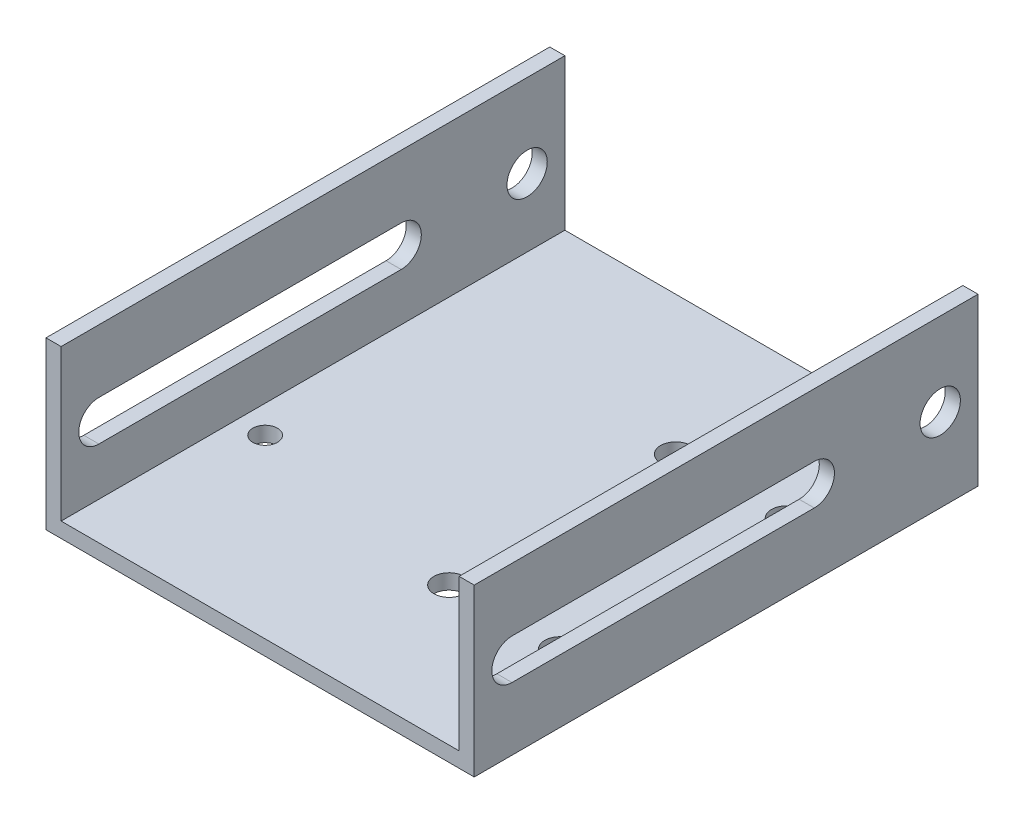
ISO-10303-21;
HEADER;
FILE_DESCRIPTION(('STEP AP214'),'2;1');
FILE_NAME('part.step','',(''),(''),'','','');
FILE_SCHEMA(('AUTOMOTIVE_DESIGN { 1 0 10303 214 1 1 1 1 }'));
ENDSEC;
DATA;
#1=APPLICATION_CONTEXT('core data for automotive mechanical design processes');
#2=APPLICATION_PROTOCOL_DEFINITION('international standard','automotive_design',2000,#1);
#3=PRODUCT_CONTEXT('',#1,'mechanical');
#4=PRODUCT('Part','Part','',(#3));
#5=PRODUCT_RELATED_PRODUCT_CATEGORY('part','',(#4));
#6=PRODUCT_DEFINITION_FORMATION('','',#4);
#7=PRODUCT_DEFINITION_CONTEXT('part definition',#1,'design');
#8=PRODUCT_DEFINITION('design','',#6,#7);
#9=PRODUCT_DEFINITION_SHAPE('','',#8);
#10=(LENGTH_UNIT() NAMED_UNIT(*) SI_UNIT(.MILLI.,.METRE.));
#11=(NAMED_UNIT(*) PLANE_ANGLE_UNIT() SI_UNIT($,.RADIAN.));
#12=(NAMED_UNIT(*) SI_UNIT($,.STERADIAN.) SOLID_ANGLE_UNIT());
#13=UNCERTAINTY_MEASURE_WITH_UNIT(LENGTH_MEASURE(1.E-05),#10,'distance_accuracy_value','');
#14=(GEOMETRIC_REPRESENTATION_CONTEXT(3) GLOBAL_UNCERTAINTY_ASSIGNED_CONTEXT((#13)) GLOBAL_UNIT_ASSIGNED_CONTEXT((#10,
#11,#12)) REPRESENTATION_CONTEXT('',''));
#15=CARTESIAN_POINT('',(0.,0.,0.));
#16=DIRECTION('',(0.,0.,1.));
#17=DIRECTION('',(1.,0.,0.));
#18=AXIS2_PLACEMENT_3D('',#15,#16,#17);
#19=CARTESIAN_POINT('',(0.,3.,0.));
#20=DIRECTION('',(0.,-1.,0.));
#21=DIRECTION('',(0.,0.,-1.));
#22=AXIS2_PLACEMENT_3D('',#19,#20,#21);
#23=PLANE('',#22);
#24=CARTESIAN_POINT('',(-34.,3.,15.));
#25=DIRECTION('',(0.,-1.,0.));
#26=DIRECTION('',(0.,0.,-1.));
#27=AXIS2_PLACEMENT_3D('',#24,#25,#26);
#28=CIRCLE('',#27,2.4454054537415);
#29=CARTESIAN_POINT('',(-34.,3.,12.5545945462585));
#30=VERTEX_POINT('',#29);
#31=EDGE_CURVE('E439',#30,#30,#28,.T.);
#32=ORIENTED_EDGE('',*,*,#31,.T.);
#33=EDGE_LOOP('',(#32));
#34=FACE_BOUND('',#33,.T.);
#35=CARTESIAN_POINT('',(21.,3.,-45.));
#36=DIRECTION('',(0.,-1.,0.));
#37=DIRECTION('',(0.,0.,-1.));
#38=AXIS2_PLACEMENT_3D('',#35,#36,#37);
#39=CIRCLE('',#38,2.00000000000001);
#40=CARTESIAN_POINT('',(21.,3.,-47.));
#41=VERTEX_POINT('',#40);
#42=EDGE_CURVE('E443',#41,#41,#39,.T.);
#43=ORIENTED_EDGE('',*,*,#42,.T.);
#44=EDGE_LOOP('',(#43));
#45=FACE_BOUND('',#44,.T.);
#46=CARTESIAN_POINT('',(32.,3.,22.5));
#47=DIRECTION('',(0.,-1.,0.));
#48=DIRECTION('',(0.,0.,-1.));
#49=AXIS2_PLACEMENT_3D('',#46,#47,#48);
#50=CIRCLE('',#49,3.);
#51=CARTESIAN_POINT('',(32.,3.,19.5));
#52=VERTEX_POINT('',#51);
#53=EDGE_CURVE('E452',#52,#52,#50,.T.);
#54=ORIENTED_EDGE('',*,*,#53,.T.);
#55=EDGE_LOOP('',(#54));
#56=FACE_BOUND('',#55,.T.);
#57=CARTESIAN_POINT('',(9.99999999999999,3.,22.5));
#58=DIRECTION('',(0.,-1.,0.));
#59=DIRECTION('',(0.,0.,-1.));
#60=AXIS2_PLACEMENT_3D('',#57,#58,#59);
#61=CIRCLE('',#60,3.);
#62=CARTESIAN_POINT('',(9.99999999999999,3.,19.5));
#63=VERTEX_POINT('',#62);
#64=EDGE_CURVE('E458',#63,#63,#61,.T.);
#65=ORIENTED_EDGE('',*,*,#64,.T.);
#66=EDGE_LOOP('',(#65));
#67=FACE_BOUND('',#66,.T.);
#68=CARTESIAN_POINT('',(32.,3.,-22.5));
#69=DIRECTION('',(0.,-1.,0.));
#70=DIRECTION('',(0.,0.,-1.));
#71=AXIS2_PLACEMENT_3D('',#68,#69,#70);
#72=CIRCLE('',#71,2.99999999999999);
#73=CARTESIAN_POINT('',(32.,3.,-25.5));
#74=VERTEX_POINT('',#73);
#75=EDGE_CURVE('E464',#74,#74,#72,.T.);
#76=ORIENTED_EDGE('',*,*,#75,.T.);
#77=EDGE_LOOP('',(#76));
#78=FACE_BOUND('',#77,.T.);
#79=CARTESIAN_POINT('',(9.99999999999999,3.,-22.5));
#80=DIRECTION('',(0.,-1.,0.));
#81=DIRECTION('',(0.,0.,-1.));
#82=AXIS2_PLACEMENT_3D('',#79,#80,#81);
#83=CIRCLE('',#82,3.);
#84=CARTESIAN_POINT('',(9.99999999999999,3.,-25.5));
#85=VERTEX_POINT('',#84);
#86=EDGE_CURVE('E470',#85,#85,#83,.T.);
#87=ORIENTED_EDGE('',*,*,#86,.T.);
#88=EDGE_LOOP('',(#87));
#89=FACE_BOUND('',#88,.T.);
#90=CARTESIAN_POINT('',(21.,3.,0.));
#91=DIRECTION('',(0.,-1.,0.));
#92=DIRECTION('',(0.,0.,-1.));
#93=AXIS2_PLACEMENT_3D('',#90,#91,#92);
#94=CIRCLE('',#93,2.99999999999999);
#95=CARTESIAN_POINT('',(21.,3.,-2.99999999999999));
#96=VERTEX_POINT('',#95);
#97=EDGE_CURVE('E476',#96,#96,#94,.T.);
#98=ORIENTED_EDGE('',*,*,#97,.T.);
#99=EDGE_LOOP('',(#98));
#100=FACE_BOUND('',#99,.T.);
#101=DIRECTION('',(0.,0.,1.));
#102=VECTOR('',#101,1.);
#103=CARTESIAN_POINT('',(39.5,3.,50.));
#104=LINE('',#103,#102);
#105=CARTESIAN_POINT('',(39.5,3.,-50.));
#106=VERTEX_POINT('',#105);
#107=CARTESIAN_POINT('',(39.5,3.,50.));
#108=VERTEX_POINT('',#107);
#109=EDGE_CURVE('E209',#106,#108,#104,.T.);
#110=ORIENTED_EDGE('',*,*,#109,.F.);
#111=DIRECTION('',(-1.,0.,0.));
#112=VECTOR('',#111,1.);
#113=CARTESIAN_POINT('',(-42.5,3.,-50.));
#114=LINE('',#113,#112);
#115=CARTESIAN_POINT('',(-39.5,3.,-50.));
#116=VERTEX_POINT('',#115);
#117=EDGE_CURVE('E260',#106,#116,#114,.T.);
#118=ORIENTED_EDGE('',*,*,#117,.T.);
#119=DIRECTION('',(0.,0.,-1.));
#120=VECTOR('',#119,1.);
#121=CARTESIAN_POINT('',(-39.5,3.,-50.));
#122=LINE('',#121,#120);
#123=CARTESIAN_POINT('',(-39.5,3.,50.));
#124=VERTEX_POINT('',#123);
#125=EDGE_CURVE('E228',#124,#116,#122,.T.);
#126=ORIENTED_EDGE('',*,*,#125,.F.);
#127=DIRECTION('',(1.,0.,0.));
#128=VECTOR('',#127,1.);
#129=CARTESIAN_POINT('',(-42.5,3.,50.));
#130=LINE('',#129,#128);
#131=EDGE_CURVE('E248',#124,#108,#130,.T.);
#132=ORIENTED_EDGE('',*,*,#131,.T.);
#133=EDGE_LOOP('',(#110,#118,#126,#132));
#134=FACE_BOUND('',#133,.T.);
#135=ADVANCED_FACE('F34',(#34,#45,#56,#67,#78,#89,#100,#134),#23,.F.);
#136=CARTESIAN_POINT('',(42.5,3.,50.));
#137=DIRECTION('',(-1.,0.,0.));
#138=DIRECTION('',(0.,0.,1.));
#139=AXIS2_PLACEMENT_3D('',#136,#137,#138);
#140=PLANE('',#139);
#141=DIRECTION('',(0.,0.,1.));
#142=VECTOR('',#141,1.);
#143=CARTESIAN_POINT('',(42.5,20.5,42.5));
#144=LINE('',#143,#142);
#145=CARTESIAN_POINT('',(42.5,20.5,-17.5));
#146=VERTEX_POINT('',#145);
#147=CARTESIAN_POINT('',(42.5,20.5,42.5));
#148=VERTEX_POINT('',#147);
#149=EDGE_CURVE('E162',#146,#148,#144,.T.);
#150=ORIENTED_EDGE('',*,*,#149,.F.);
#151=CARTESIAN_POINT('',(42.5,16.5,-17.5));
#152=DIRECTION('',(1.,0.,0.));
#153=DIRECTION('',(0.,0.,-1.));
#154=AXIS2_PLACEMENT_3D('',#151,#152,#153);
#155=CIRCLE('',#154,4.);
#156=CARTESIAN_POINT('',(42.5,12.5,-17.5));
#157=VERTEX_POINT('',#156);
#158=EDGE_CURVE('E49',#157,#146,#155,.T.);
#159=ORIENTED_EDGE('',*,*,#158,.F.);
#160=DIRECTION('',(0.,0.,-1.));
#161=VECTOR('',#160,1.);
#162=CARTESIAN_POINT('',(42.5,12.5,42.5));
#163=LINE('',#162,#161);
#164=CARTESIAN_POINT('',(42.5,12.5,42.5));
#165=VERTEX_POINT('',#164);
#166=EDGE_CURVE('E169',#165,#157,#163,.T.);
#167=ORIENTED_EDGE('',*,*,#166,.F.);
#168=CARTESIAN_POINT('',(42.5,16.5,42.5));
#169=DIRECTION('',(1.,0.,0.));
#170=DIRECTION('',(0.,0.,-1.));
#171=AXIS2_PLACEMENT_3D('',#168,#169,#170);
#172=CIRCLE('',#171,4.00000000000001);
#173=EDGE_CURVE('E153',#148,#165,#172,.T.);
#174=ORIENTED_EDGE('',*,*,#173,.F.);
#175=EDGE_LOOP('',(#150,#159,#167,#174));
#176=FACE_BOUND('',#175,.T.);
#177=CARTESIAN_POINT('',(42.5,16.5,-42.5));
#178=DIRECTION('',(1.,0.,0.));
#179=DIRECTION('',(0.,0.,-1.));
#180=AXIS2_PLACEMENT_3D('',#177,#178,#179);
#181=CIRCLE('',#180,4.00000000000001);
#182=CARTESIAN_POINT('',(42.5,16.5,-46.5));
#183=VERTEX_POINT('',#182);
#184=EDGE_CURVE('E199',#183,#183,#181,.T.);
#185=ORIENTED_EDGE('',*,*,#184,.F.);
#186=EDGE_LOOP('',(#185));
#187=FACE_BOUND('',#186,.T.);
#188=DIRECTION('',(0.,0.,-1.));
#189=VECTOR('',#188,1.);
#190=CARTESIAN_POINT('',(42.5,0.,50.));
#191=LINE('',#190,#189);
#192=CARTESIAN_POINT('',(42.5,0.,50.));
#193=VERTEX_POINT('',#192);
#194=CARTESIAN_POINT('',(42.5,0.,-50.));
#195=VERTEX_POINT('',#194);
#196=EDGE_CURVE('E257',#193,#195,#191,.T.);
#197=ORIENTED_EDGE('',*,*,#196,.T.);
#198=DIRECTION('',(0.,-1.,0.));
#199=VECTOR('',#198,1.);
#200=CARTESIAN_POINT('',(42.5,3.,-50.));
#201=LINE('',#200,#199);
#202=CARTESIAN_POINT('',(42.5,33.,-50.));
#203=VERTEX_POINT('',#202);
#204=EDGE_CURVE('E267',#203,#195,#201,.T.);
#205=ORIENTED_EDGE('',*,*,#204,.F.);
#206=DIRECTION('',(0.,0.,-1.));
#207=VECTOR('',#206,1.);
#208=CARTESIAN_POINT('',(42.5,33.,50.));
#209=LINE('',#208,#207);
#210=CARTESIAN_POINT('',(42.5,33.,50.));
#211=VERTEX_POINT('',#210);
#212=EDGE_CURVE('E210',#211,#203,#209,.T.);
#213=ORIENTED_EDGE('',*,*,#212,.F.);
#214=DIRECTION('',(0.,-1.,0.));
#215=VECTOR('',#214,1.);
#216=CARTESIAN_POINT('',(42.5,3.,50.));
#217=LINE('',#216,#215);
#218=EDGE_CURVE('E338',#211,#193,#217,.T.);
#219=ORIENTED_EDGE('',*,*,#218,.T.);
#220=EDGE_LOOP('',(#197,#205,#213,#219));
#221=FACE_BOUND('',#220,.T.);
#222=ADVANCED_FACE('F36',(#176,#187,#221),#140,.F.);
#223=CARTESIAN_POINT('',(-42.5,3.,-50.));
#224=DIRECTION('',(0.,0.,1.));
#225=DIRECTION('',(1.,0.,0.));
#226=AXIS2_PLACEMENT_3D('',#223,#224,#225);
#227=PLANE('',#226);
#228=DIRECTION('',(-1.,0.,0.));
#229=VECTOR('',#228,1.);
#230=CARTESIAN_POINT('',(-42.5,0.,-50.));
#231=LINE('',#230,#229);
#232=CARTESIAN_POINT('',(-42.5,0.,-50.));
#233=VERTEX_POINT('',#232);
#234=EDGE_CURVE('E317',#195,#233,#231,.T.);
#235=ORIENTED_EDGE('',*,*,#234,.T.);
#236=DIRECTION('',(0.,-1.,0.));
#237=VECTOR('',#236,1.);
#238=CARTESIAN_POINT('',(-42.5,3.,-50.));
#239=LINE('',#238,#237);
#240=CARTESIAN_POINT('',(-42.5,33.,-50.));
#241=VERTEX_POINT('',#240);
#242=EDGE_CURVE('E320',#241,#233,#239,.T.);
#243=ORIENTED_EDGE('',*,*,#242,.F.);
#244=DIRECTION('',(-1.,0.,0.));
#245=VECTOR('',#244,1.);
#246=CARTESIAN_POINT('',(-42.5,33.,-50.));
#247=LINE('',#246,#245);
#248=CARTESIAN_POINT('',(-39.5,33.,-50.));
#249=VERTEX_POINT('',#248);
#250=EDGE_CURVE('E236',#249,#241,#247,.T.);
#251=ORIENTED_EDGE('',*,*,#250,.F.);
#252=DIRECTION('',(0.,-1.,0.));
#253=VECTOR('',#252,1.);
#254=CARTESIAN_POINT('',(-39.5,33.,-50.));
#255=LINE('',#254,#253);
#256=EDGE_CURVE('E239',#249,#116,#255,.T.);
#257=ORIENTED_EDGE('',*,*,#256,.T.);
#258=ORIENTED_EDGE('',*,*,#117,.F.);
#259=DIRECTION('',(0.,-1.,0.));
#260=VECTOR('',#259,1.);
#261=CARTESIAN_POINT('',(39.5,33.,-50.));
#262=LINE('',#261,#260);
#263=CARTESIAN_POINT('',(39.5,33.,-50.));
#264=VERTEX_POINT('',#263);
#265=EDGE_CURVE('E225',#264,#106,#262,.T.);
#266=ORIENTED_EDGE('',*,*,#265,.F.);
#267=DIRECTION('',(-1.,0.,0.));
#268=VECTOR('',#267,1.);
#269=CARTESIAN_POINT('',(42.5,33.,-50.));
#270=LINE('',#269,#268);
#271=EDGE_CURVE('E213',#203,#264,#270,.T.);
#272=ORIENTED_EDGE('',*,*,#271,.F.);
#273=ORIENTED_EDGE('',*,*,#204,.T.);
#274=EDGE_LOOP('',(#235,#243,#251,#257,#258,#266,#272,#273));
#275=FACE_BOUND('',#274,.T.);
#276=ADVANCED_FACE('F294',(#275),#227,.F.);
#277=CARTESIAN_POINT('',(-42.5,3.,50.));
#278=DIRECTION('',(1.,0.,0.));
#279=DIRECTION('',(0.,0.,-1.));
#280=AXIS2_PLACEMENT_3D('',#277,#278,#279);
#281=PLANE('',#280);
#282=DIRECTION('',(0.,0.,1.));
#283=VECTOR('',#282,1.);
#284=CARTESIAN_POINT('',(-42.5,12.5,42.5));
#285=LINE('',#284,#283);
#286=CARTESIAN_POINT('',(-42.5,12.5,-17.5));
#287=VERTEX_POINT('',#286);
#288=CARTESIAN_POINT('',(-42.5,12.5,42.5));
#289=VERTEX_POINT('',#288);
#290=EDGE_CURVE('E480',#287,#289,#285,.T.);
#291=ORIENTED_EDGE('',*,*,#290,.F.);
#292=CARTESIAN_POINT('',(-42.5,16.5,-17.5));
#293=DIRECTION('',(1.,0.,0.));
#294=DIRECTION('',(0.,0.,-1.));
#295=AXIS2_PLACEMENT_3D('',#292,#293,#294);
#296=CIRCLE('',#295,4.);
#297=CARTESIAN_POINT('',(-42.5,20.5,-17.5));
#298=VERTEX_POINT('',#297);
#299=EDGE_CURVE('E187',#298,#287,#296,.F.);
#300=ORIENTED_EDGE('',*,*,#299,.F.);
#301=DIRECTION('',(0.,0.,-1.));
#302=VECTOR('',#301,1.);
#303=CARTESIAN_POINT('',(-42.5,20.5,42.5));
#304=LINE('',#303,#302);
#305=CARTESIAN_POINT('',(-42.5,20.5,42.5));
#306=VERTEX_POINT('',#305);
#307=EDGE_CURVE('E184',#306,#298,#304,.T.);
#308=ORIENTED_EDGE('',*,*,#307,.F.);
#309=CARTESIAN_POINT('',(-42.5,16.5,42.5));
#310=DIRECTION('',(1.,0.,0.));
#311=DIRECTION('',(0.,0.,-1.));
#312=AXIS2_PLACEMENT_3D('',#309,#310,#311);
#313=CIRCLE('',#312,4.00000000000001);
#314=EDGE_CURVE('E177',#289,#306,#313,.F.);
#315=ORIENTED_EDGE('',*,*,#314,.F.);
#316=EDGE_LOOP('',(#291,#300,#308,#315));
#317=FACE_BOUND('',#316,.T.);
#318=CARTESIAN_POINT('',(-42.5,16.5,-42.5));
#319=DIRECTION('',(1.,0.,0.));
#320=DIRECTION('',(0.,0.,-1.));
#321=AXIS2_PLACEMENT_3D('',#318,#319,#320);
#322=CIRCLE('',#321,4.00000000000001);
#323=CARTESIAN_POINT('',(-42.5,16.5,-46.5));
#324=VERTEX_POINT('',#323);
#325=EDGE_CURVE('E202',#324,#324,#322,.F.);
#326=ORIENTED_EDGE('',*,*,#325,.F.);
#327=EDGE_LOOP('',(#326));
#328=FACE_BOUND('',#327,.T.);
#329=DIRECTION('',(0.,0.,1.));
#330=VECTOR('',#329,1.);
#331=CARTESIAN_POINT('',(-42.5,0.,50.));
#332=LINE('',#331,#330);
#333=CARTESIAN_POINT('',(-42.5,0.,50.));
#334=VERTEX_POINT('',#333);
#335=EDGE_CURVE('E326',#233,#334,#332,.T.);
#336=ORIENTED_EDGE('',*,*,#335,.T.);
#337=DIRECTION('',(0.,-1.,0.));
#338=VECTOR('',#337,1.);
#339=CARTESIAN_POINT('',(-42.5,3.,50.));
#340=LINE('',#339,#338);
#341=CARTESIAN_POINT('',(-42.5,33.,50.));
#342=VERTEX_POINT('',#341);
#343=EDGE_CURVE('E331',#342,#334,#340,.T.);
#344=ORIENTED_EDGE('',*,*,#343,.F.);
#345=DIRECTION('',(0.,0.,1.));
#346=VECTOR('',#345,1.);
#347=CARTESIAN_POINT('',(-42.5,33.,-50.));
#348=LINE('',#347,#346);
#349=EDGE_CURVE('E229',#241,#342,#348,.T.);
#350=ORIENTED_EDGE('',*,*,#349,.F.);
#351=ORIENTED_EDGE('',*,*,#242,.T.);
#352=EDGE_LOOP('',(#336,#344,#350,#351));
#353=FACE_BOUND('',#352,.T.);
#354=ADVANCED_FACE('F308',(#317,#328,#353),#281,.F.);
#355=CARTESIAN_POINT('',(-42.5,3.,50.));
#356=DIRECTION('',(0.,0.,-1.));
#357=DIRECTION('',(-1.,0.,0.));
#358=AXIS2_PLACEMENT_3D('',#355,#356,#357);
#359=PLANE('',#358);
#360=DIRECTION('',(1.,0.,0.));
#361=VECTOR('',#360,1.);
#362=CARTESIAN_POINT('',(-42.5,0.,50.));
#363=LINE('',#362,#361);
#364=EDGE_CURVE('E262',#334,#193,#363,.T.);
#365=ORIENTED_EDGE('',*,*,#364,.T.);
#366=ORIENTED_EDGE('',*,*,#218,.F.);
#367=DIRECTION('',(1.,0.,0.));
#368=VECTOR('',#367,1.);
#369=CARTESIAN_POINT('',(42.5,33.,50.));
#370=LINE('',#369,#368);
#371=CARTESIAN_POINT('',(39.5,33.,50.));
#372=VERTEX_POINT('',#371);
#373=EDGE_CURVE('E217',#372,#211,#370,.T.);
#374=ORIENTED_EDGE('',*,*,#373,.F.);
#375=DIRECTION('',(0.,-1.,0.));
#376=VECTOR('',#375,1.);
#377=CARTESIAN_POINT('',(39.5,33.,50.));
#378=LINE('',#377,#376);
#379=EDGE_CURVE('E220',#372,#108,#378,.T.);
#380=ORIENTED_EDGE('',*,*,#379,.T.);
#381=ORIENTED_EDGE('',*,*,#131,.F.);
#382=DIRECTION('',(0.,-1.,0.));
#383=VECTOR('',#382,1.);
#384=CARTESIAN_POINT('',(-39.5,33.,50.));
#385=LINE('',#384,#383);
#386=CARTESIAN_POINT('',(-39.5,33.,50.));
#387=VERTEX_POINT('',#386);
#388=EDGE_CURVE('E252',#387,#124,#385,.T.);
#389=ORIENTED_EDGE('',*,*,#388,.F.);
#390=DIRECTION('',(1.,0.,0.));
#391=VECTOR('',#390,1.);
#392=CARTESIAN_POINT('',(-42.5,33.,50.));
#393=LINE('',#392,#391);
#394=EDGE_CURVE('E232',#342,#387,#393,.T.);
#395=ORIENTED_EDGE('',*,*,#394,.F.);
#396=ORIENTED_EDGE('',*,*,#343,.T.);
#397=EDGE_LOOP('',(#365,#366,#374,#380,#381,#389,#395,#396));
#398=FACE_BOUND('',#397,.T.);
#399=ADVANCED_FACE('F304',(#398),#359,.F.);
#400=CARTESIAN_POINT('',(0.,0.,0.));
#401=DIRECTION('',(0.,-1.,0.));
#402=DIRECTION('',(0.,0.,-1.));
#403=AXIS2_PLACEMENT_3D('',#400,#401,#402);
#404=PLANE('',#403);
#405=CARTESIAN_POINT('',(-34.,0.,15.));
#406=DIRECTION('',(0.,-1.,0.));
#407=DIRECTION('',(0.,0.,-1.));
#408=AXIS2_PLACEMENT_3D('',#405,#406,#407);
#409=CIRCLE('',#408,2.4454054537415);
#410=CARTESIAN_POINT('',(-34.,0.,12.5545945462585));
#411=VERTEX_POINT('',#410);
#412=EDGE_CURVE('E437',#411,#411,#409,.T.);
#413=ORIENTED_EDGE('',*,*,#412,.F.);
#414=EDGE_LOOP('',(#413));
#415=FACE_BOUND('',#414,.T.);
#416=CARTESIAN_POINT('',(21.,0.,-45.));
#417=DIRECTION('',(0.,-1.,0.));
#418=DIRECTION('',(0.,0.,-1.));
#419=AXIS2_PLACEMENT_3D('',#416,#417,#418);
#420=CIRCLE('',#419,2.00000000000001);
#421=CARTESIAN_POINT('',(21.,0.,-47.));
#422=VERTEX_POINT('',#421);
#423=EDGE_CURVE('E440',#422,#422,#420,.T.);
#424=ORIENTED_EDGE('',*,*,#423,.F.);
#425=EDGE_LOOP('',(#424));
#426=FACE_BOUND('',#425,.T.);
#427=CARTESIAN_POINT('',(32.,0.,22.5));
#428=DIRECTION('',(0.,-1.,0.));
#429=DIRECTION('',(0.,0.,-1.));
#430=AXIS2_PLACEMENT_3D('',#427,#428,#429);
#431=CIRCLE('',#430,3.);
#432=CARTESIAN_POINT('',(32.,0.,19.5));
#433=VERTEX_POINT('',#432);
#434=EDGE_CURVE('E449',#433,#433,#431,.T.);
#435=ORIENTED_EDGE('',*,*,#434,.F.);
#436=EDGE_LOOP('',(#435));
#437=FACE_BOUND('',#436,.T.);
#438=CARTESIAN_POINT('',(9.99999999999999,0.,22.5));
#439=DIRECTION('',(0.,-1.,0.));
#440=DIRECTION('',(0.,0.,1.));
#441=AXIS2_PLACEMENT_3D('',#438,#439,#440);
#442=CIRCLE('',#441,3.);
#443=CARTESIAN_POINT('',(9.99999999999999,0.,25.5));
#444=VERTEX_POINT('',#443);
#445=EDGE_CURVE('E455',#444,#444,#442,.T.);
#446=ORIENTED_EDGE('',*,*,#445,.F.);
#447=EDGE_LOOP('',(#446));
#448=FACE_BOUND('',#447,.T.);
#449=CARTESIAN_POINT('',(32.,0.,-22.5));
#450=DIRECTION('',(0.,-1.,0.));
#451=DIRECTION('',(0.,0.,1.));
#452=AXIS2_PLACEMENT_3D('',#449,#450,#451);
#453=CIRCLE('',#452,2.99999999999999);
#454=CARTESIAN_POINT('',(32.,0.,-19.5));
#455=VERTEX_POINT('',#454);
#456=EDGE_CURVE('E461',#455,#455,#453,.T.);
#457=ORIENTED_EDGE('',*,*,#456,.F.);
#458=EDGE_LOOP('',(#457));
#459=FACE_BOUND('',#458,.T.);
#460=CARTESIAN_POINT('',(9.99999999999999,0.,-22.5));
#461=DIRECTION('',(0.,-1.,0.));
#462=DIRECTION('',(0.,0.,-1.));
#463=AXIS2_PLACEMENT_3D('',#460,#461,#462);
#464=CIRCLE('',#463,3.);
#465=CARTESIAN_POINT('',(9.99999999999999,0.,-25.5));
#466=VERTEX_POINT('',#465);
#467=EDGE_CURVE('E467',#466,#466,#464,.T.);
#468=ORIENTED_EDGE('',*,*,#467,.F.);
#469=EDGE_LOOP('',(#468));
#470=FACE_BOUND('',#469,.T.);
#471=CARTESIAN_POINT('',(21.,0.,0.));
#472=DIRECTION('',(0.,-1.,0.));
#473=DIRECTION('',(0.,0.,-1.));
#474=AXIS2_PLACEMENT_3D('',#471,#472,#473);
#475=CIRCLE('',#474,2.99999999999999);
#476=CARTESIAN_POINT('',(21.,0.,-2.99999999999999));
#477=VERTEX_POINT('',#476);
#478=EDGE_CURVE('E473',#477,#477,#475,.T.);
#479=ORIENTED_EDGE('',*,*,#478,.F.);
#480=EDGE_LOOP('',(#479));
#481=FACE_BOUND('',#480,.T.);
#482=ORIENTED_EDGE('',*,*,#196,.F.);
#483=ORIENTED_EDGE('',*,*,#364,.F.);
#484=ORIENTED_EDGE('',*,*,#335,.F.);
#485=ORIENTED_EDGE('',*,*,#234,.F.);
#486=EDGE_LOOP('',(#482,#483,#484,#485));
#487=FACE_BOUND('',#486,.T.);
#488=ADVANCED_FACE('F301',(#415,#426,#437,#448,#459,#470,#481,#487),#404,.T.);
#489=CARTESIAN_POINT('',(-39.5,33.,-50.));
#490=DIRECTION('',(-1.,0.,0.));
#491=DIRECTION('',(0.,0.,1.));
#492=AXIS2_PLACEMENT_3D('',#489,#490,#491);
#493=PLANE('',#492);
#494=DIRECTION('',(0.,0.,-1.));
#495=VECTOR('',#494,1.);
#496=CARTESIAN_POINT('',(-39.5,20.5,-50.));
#497=LINE('',#496,#495);
#498=CARTESIAN_POINT('',(-39.5,20.5,42.5));
#499=VERTEX_POINT('',#498);
#500=CARTESIAN_POINT('',(-39.5,20.5,-17.5));
#501=VERTEX_POINT('',#500);
#502=EDGE_CURVE('E186',#499,#501,#497,.T.);
#503=ORIENTED_EDGE('',*,*,#502,.T.);
#504=CARTESIAN_POINT('',(-39.5,16.5,-17.5));
#505=DIRECTION('',(-1.,0.,0.));
#506=DIRECTION('',(0.,0.,1.));
#507=AXIS2_PLACEMENT_3D('',#504,#505,#506);
#508=CIRCLE('',#507,4.);
#509=CARTESIAN_POINT('',(-39.5,12.5,-17.5));
#510=VERTEX_POINT('',#509);
#511=EDGE_CURVE('E196',#501,#510,#508,.T.);
#512=ORIENTED_EDGE('',*,*,#511,.T.);
#513=DIRECTION('',(0.,0.,1.));
#514=VECTOR('',#513,1.);
#515=CARTESIAN_POINT('',(-39.5,12.5,-50.));
#516=LINE('',#515,#514);
#517=CARTESIAN_POINT('',(-39.5,12.5,42.5));
#518=VERTEX_POINT('',#517);
#519=EDGE_CURVE('E193',#510,#518,#516,.T.);
#520=ORIENTED_EDGE('',*,*,#519,.T.);
#521=CARTESIAN_POINT('',(-39.5,16.5,42.5));
#522=DIRECTION('',(-1.,0.,0.));
#523=DIRECTION('',(0.,0.,1.));
#524=AXIS2_PLACEMENT_3D('',#521,#522,#523);
#525=CIRCLE('',#524,4.00000000000001);
#526=EDGE_CURVE('E190',#518,#499,#525,.T.);
#527=ORIENTED_EDGE('',*,*,#526,.T.);
#528=EDGE_LOOP('',(#503,#512,#520,#527));
#529=FACE_BOUND('',#528,.T.);
#530=CARTESIAN_POINT('',(-39.5,16.5,-42.5));
#531=DIRECTION('',(-1.,0.,0.));
#532=DIRECTION('',(0.,0.,1.));
#533=AXIS2_PLACEMENT_3D('',#530,#531,#532);
#534=CIRCLE('',#533,4.00000000000001);
#535=CARTESIAN_POINT('',(-39.5,16.5,-38.5));
#536=VERTEX_POINT('',#535);
#537=EDGE_CURVE('E206',#536,#536,#534,.T.);
#538=ORIENTED_EDGE('',*,*,#537,.T.);
#539=EDGE_LOOP('',(#538));
#540=FACE_BOUND('',#539,.T.);
#541=ORIENTED_EDGE('',*,*,#125,.T.);
#542=ORIENTED_EDGE('',*,*,#256,.F.);
#543=DIRECTION('',(0.,0.,-1.));
#544=VECTOR('',#543,1.);
#545=CARTESIAN_POINT('',(-39.5,33.,-50.));
#546=LINE('',#545,#544);
#547=EDGE_CURVE('E234',#387,#249,#546,.T.);
#548=ORIENTED_EDGE('',*,*,#547,.F.);
#549=ORIENTED_EDGE('',*,*,#388,.T.);
#550=EDGE_LOOP('',(#541,#542,#548,#549));
#551=FACE_BOUND('',#550,.T.);
#552=ADVANCED_FACE('F299',(#529,#540,#551),#493,.F.);
#553=CARTESIAN_POINT('',(0.,33.,0.));
#554=DIRECTION('',(0.,1.,0.));
#555=DIRECTION('',(0.,0.,1.));
#556=AXIS2_PLACEMENT_3D('',#553,#554,#555);
#557=PLANE('',#556);
#558=ORIENTED_EDGE('',*,*,#349,.T.);
#559=ORIENTED_EDGE('',*,*,#394,.T.);
#560=ORIENTED_EDGE('',*,*,#547,.T.);
#561=ORIENTED_EDGE('',*,*,#250,.T.);
#562=EDGE_LOOP('',(#558,#559,#560,#561));
#563=FACE_BOUND('',#562,.T.);
#564=ADVANCED_FACE('F346',(#563),#557,.T.);
#565=CARTESIAN_POINT('',(39.5,33.,50.));
#566=DIRECTION('',(1.,0.,0.));
#567=DIRECTION('',(0.,0.,-1.));
#568=AXIS2_PLACEMENT_3D('',#565,#566,#567);
#569=PLANE('',#568);
#570=DIRECTION('',(0.,0.,-1.));
#571=VECTOR('',#570,1.);
#572=CARTESIAN_POINT('',(39.5,12.5,50.));
#573=LINE('',#572,#571);
#574=CARTESIAN_POINT('',(39.5,12.5,42.5));
#575=VERTEX_POINT('',#574);
#576=CARTESIAN_POINT('',(39.5,12.5,-17.5));
#577=VERTEX_POINT('',#576);
#578=EDGE_CURVE('E42',#575,#577,#573,.T.);
#579=ORIENTED_EDGE('',*,*,#578,.T.);
#580=CARTESIAN_POINT('',(39.5,16.5,-17.5));
#581=DIRECTION('',(1.,0.,0.));
#582=DIRECTION('',(0.,0.,-1.));
#583=AXIS2_PLACEMENT_3D('',#580,#581,#582);
#584=CIRCLE('',#583,4.);
#585=CARTESIAN_POINT('',(39.5,20.5,-17.5));
#586=VERTEX_POINT('',#585);
#587=EDGE_CURVE('E11',#577,#586,#584,.T.);
#588=ORIENTED_EDGE('',*,*,#587,.T.);
#589=DIRECTION('',(0.,0.,1.));
#590=VECTOR('',#589,1.);
#591=CARTESIAN_POINT('',(39.5,20.5,50.));
#592=LINE('',#591,#590);
#593=CARTESIAN_POINT('',(39.5,20.5,42.5));
#594=VERTEX_POINT('',#593);
#595=EDGE_CURVE('E265',#586,#594,#592,.T.);
#596=ORIENTED_EDGE('',*,*,#595,.T.);
#597=CARTESIAN_POINT('',(39.5,16.5,42.5));
#598=DIRECTION('',(1.,0.,0.));
#599=DIRECTION('',(0.,0.,-1.));
#600=AXIS2_PLACEMENT_3D('',#597,#598,#599);
#601=CIRCLE('',#600,4.00000000000001);
#602=EDGE_CURVE('E156',#594,#575,#601,.T.);
#603=ORIENTED_EDGE('',*,*,#602,.T.);
#604=EDGE_LOOP('',(#579,#588,#596,#603));
#605=FACE_BOUND('',#604,.T.);
#606=CARTESIAN_POINT('',(39.5,16.5,-42.5));
#607=DIRECTION('',(1.,0.,0.));
#608=DIRECTION('',(0.,0.,-1.));
#609=AXIS2_PLACEMENT_3D('',#606,#607,#608);
#610=CIRCLE('',#609,4.00000000000001);
#611=CARTESIAN_POINT('',(39.5,16.5,-46.5));
#612=VERTEX_POINT('',#611);
#613=EDGE_CURVE('E205',#612,#612,#610,.T.);
#614=ORIENTED_EDGE('',*,*,#613,.T.);
#615=EDGE_LOOP('',(#614));
#616=FACE_BOUND('',#615,.T.);
#617=ORIENTED_EDGE('',*,*,#109,.T.);
#618=ORIENTED_EDGE('',*,*,#379,.F.);
#619=DIRECTION('',(0.,0.,1.));
#620=VECTOR('',#619,1.);
#621=CARTESIAN_POINT('',(39.5,33.,50.));
#622=LINE('',#621,#620);
#623=EDGE_CURVE('E215',#264,#372,#622,.T.);
#624=ORIENTED_EDGE('',*,*,#623,.F.);
#625=ORIENTED_EDGE('',*,*,#265,.T.);
#626=EDGE_LOOP('',(#617,#618,#624,#625));
#627=FACE_BOUND('',#626,.T.);
#628=ADVANCED_FACE('F270',(#605,#616,#627),#569,.F.);
#629=CARTESIAN_POINT('',(0.,33.,0.));
#630=DIRECTION('',(0.,1.,0.));
#631=DIRECTION('',(0.,0.,1.));
#632=AXIS2_PLACEMENT_3D('',#629,#630,#631);
#633=PLANE('',#632);
#634=ORIENTED_EDGE('',*,*,#212,.T.);
#635=ORIENTED_EDGE('',*,*,#271,.T.);
#636=ORIENTED_EDGE('',*,*,#623,.T.);
#637=ORIENTED_EDGE('',*,*,#373,.T.);
#638=EDGE_LOOP('',(#634,#635,#636,#637));
#639=FACE_BOUND('',#638,.T.);
#640=ADVANCED_FACE('F358',(#639),#633,.T.);
#641=CARTESIAN_POINT('',(-110.968971074495,16.5,-42.5));
#642=DIRECTION('',(1.,0.,0.));
#643=DIRECTION('',(0.,0.,-1.));
#644=AXIS2_PLACEMENT_3D('',#641,#642,#643);
#645=CYLINDRICAL_SURFACE('',#644,4.00000000000001);
#646=ORIENTED_EDGE('',*,*,#184,.T.);
#647=EDGE_LOOP('',(#646));
#648=FACE_BOUND('',#647,.T.);
#649=ORIENTED_EDGE('',*,*,#613,.F.);
#650=EDGE_LOOP('',(#649));
#651=FACE_BOUND('',#650,.T.);
#652=ADVANCED_FACE('F362',(#648,#651),#645,.F.);
#653=ORIENTED_EDGE('',*,*,#325,.T.);
#654=EDGE_LOOP('',(#653));
#655=FACE_BOUND('',#654,.T.);
#656=ORIENTED_EDGE('',*,*,#537,.F.);
#657=EDGE_LOOP('',(#656));
#658=FACE_BOUND('',#657,.T.);
#659=ADVANCED_FACE('F368',(#655,#658),#645,.F.);
#660=CARTESIAN_POINT('',(-110.968971074495,20.5,42.5));
#661=DIRECTION('',(0.,1.,0.));
#662=DIRECTION('',(0.,0.,1.));
#663=AXIS2_PLACEMENT_3D('',#660,#661,#662);
#664=PLANE('',#663);
#665=DIRECTION('',(1.,0.,0.));
#666=VECTOR('',#665,1.);
#667=CARTESIAN_POINT('',(-110.968971074495,20.5,-17.5));
#668=LINE('',#667,#666);
#669=EDGE_CURVE('E164',#586,#146,#668,.T.);
#670=ORIENTED_EDGE('',*,*,#669,.T.);
#671=ORIENTED_EDGE('',*,*,#149,.T.);
#672=DIRECTION('',(1.,0.,0.));
#673=VECTOR('',#672,1.);
#674=CARTESIAN_POINT('',(-110.968971074495,20.5,42.5));
#675=LINE('',#674,#673);
#676=EDGE_CURVE('E148',#594,#148,#675,.T.);
#677=ORIENTED_EDGE('',*,*,#676,.F.);
#678=ORIENTED_EDGE('',*,*,#595,.F.);
#679=EDGE_LOOP('',(#670,#671,#677,#678));
#680=FACE_BOUND('',#679,.T.);
#681=ADVANCED_FACE('F163',(#680),#664,.F.);
#682=CARTESIAN_POINT('',(-110.968971074495,16.5,42.5));
#683=DIRECTION('',(1.,0.,0.));
#684=DIRECTION('',(0.,0.,-1.));
#685=AXIS2_PLACEMENT_3D('',#682,#683,#684);
#686=CYLINDRICAL_SURFACE('',#685,4.00000000000001);
#687=ORIENTED_EDGE('',*,*,#676,.T.);
#688=ORIENTED_EDGE('',*,*,#173,.T.);
#689=DIRECTION('',(1.,0.,0.));
#690=VECTOR('',#689,1.);
#691=CARTESIAN_POINT('',(-110.968971074495,12.5,42.5));
#692=LINE('',#691,#690);
#693=EDGE_CURVE('E181',#575,#165,#692,.T.);
#694=ORIENTED_EDGE('',*,*,#693,.F.);
#695=ORIENTED_EDGE('',*,*,#602,.F.);
#696=EDGE_LOOP('',(#687,#688,#694,#695));
#697=FACE_BOUND('',#696,.T.);
#698=ADVANCED_FACE('F150',(#697),#686,.F.);
#699=CARTESIAN_POINT('',(-110.968971074495,12.5,42.5));
#700=DIRECTION('',(0.,-1.,0.));
#701=DIRECTION('',(0.,0.,-1.));
#702=AXIS2_PLACEMENT_3D('',#699,#700,#701);
#703=PLANE('',#702);
#704=ORIENTED_EDGE('',*,*,#693,.T.);
#705=ORIENTED_EDGE('',*,*,#166,.T.);
#706=DIRECTION('',(1.,0.,0.));
#707=VECTOR('',#706,1.);
#708=CARTESIAN_POINT('',(-110.968971074495,12.5,-17.5));
#709=LINE('',#708,#707);
#710=EDGE_CURVE('E178',#577,#157,#709,.T.);
#711=ORIENTED_EDGE('',*,*,#710,.F.);
#712=ORIENTED_EDGE('',*,*,#578,.F.);
#713=EDGE_LOOP('',(#704,#705,#711,#712));
#714=FACE_BOUND('',#713,.T.);
#715=ADVANCED_FACE('F274',(#714),#703,.F.);
#716=CARTESIAN_POINT('',(-110.968971074495,16.5,-17.5));
#717=DIRECTION('',(1.,0.,0.));
#718=DIRECTION('',(0.,0.,-1.));
#719=AXIS2_PLACEMENT_3D('',#716,#717,#718);
#720=CYLINDRICAL_SURFACE('',#719,4.);
#721=ORIENTED_EDGE('',*,*,#710,.T.);
#722=ORIENTED_EDGE('',*,*,#158,.T.);
#723=ORIENTED_EDGE('',*,*,#669,.F.);
#724=ORIENTED_EDGE('',*,*,#587,.F.);
#725=EDGE_LOOP('',(#721,#722,#723,#724));
#726=FACE_BOUND('',#725,.T.);
#727=ADVANCED_FACE('F275',(#726),#720,.F.);
#728=EDGE_CURVE('E159',#298,#501,#668,.T.);
#729=ORIENTED_EDGE('',*,*,#728,.F.);
#730=ORIENTED_EDGE('',*,*,#299,.T.);
#731=EDGE_CURVE('E174',#287,#510,#709,.T.);
#732=ORIENTED_EDGE('',*,*,#731,.T.);
#733=ORIENTED_EDGE('',*,*,#511,.F.);
#734=EDGE_LOOP('',(#729,#730,#732,#733));
#735=FACE_BOUND('',#734,.T.);
#736=ADVANCED_FACE('F277',(#735),#720,.F.);
#737=ORIENTED_EDGE('',*,*,#731,.F.);
#738=ORIENTED_EDGE('',*,*,#290,.T.);
#739=EDGE_CURVE('E179',#289,#518,#692,.T.);
#740=ORIENTED_EDGE('',*,*,#739,.T.);
#741=ORIENTED_EDGE('',*,*,#519,.F.);
#742=EDGE_LOOP('',(#737,#738,#740,#741));
#743=FACE_BOUND('',#742,.T.);
#744=ADVANCED_FACE('F283',(#743),#703,.F.);
#745=ORIENTED_EDGE('',*,*,#739,.F.);
#746=ORIENTED_EDGE('',*,*,#314,.T.);
#747=EDGE_CURVE('E57',#306,#499,#675,.T.);
#748=ORIENTED_EDGE('',*,*,#747,.T.);
#749=ORIENTED_EDGE('',*,*,#526,.F.);
#750=EDGE_LOOP('',(#745,#746,#748,#749));
#751=FACE_BOUND('',#750,.T.);
#752=ADVANCED_FACE('F393',(#751),#686,.F.);
#753=ORIENTED_EDGE('',*,*,#747,.F.);
#754=ORIENTED_EDGE('',*,*,#307,.T.);
#755=ORIENTED_EDGE('',*,*,#728,.T.);
#756=ORIENTED_EDGE('',*,*,#502,.F.);
#757=EDGE_LOOP('',(#753,#754,#755,#756));
#758=FACE_BOUND('',#757,.T.);
#759=ADVANCED_FACE('F386',(#758),#664,.F.);
#760=CARTESIAN_POINT('',(21.,33.000025,0.));
#761=DIRECTION('',(0.,-1.,0.));
#762=DIRECTION('',(0.,0.,-1.));
#763=AXIS2_PLACEMENT_3D('',#760,#761,#762);
#764=CYLINDRICAL_SURFACE('',#763,2.99999999999999);
#765=ORIENTED_EDGE('',*,*,#478,.T.);
#766=EDGE_LOOP('',(#765));
#767=FACE_BOUND('',#766,.T.);
#768=ORIENTED_EDGE('',*,*,#97,.F.);
#769=EDGE_LOOP('',(#768));
#770=FACE_BOUND('',#769,.T.);
#771=ADVANCED_FACE('F395',(#767,#770),#764,.F.);
#772=CARTESIAN_POINT('',(9.99999999999999,33.000025,-22.5));
#773=DIRECTION('',(0.,-1.,0.));
#774=DIRECTION('',(0.,0.,-1.));
#775=AXIS2_PLACEMENT_3D('',#772,#773,#774);
#776=CYLINDRICAL_SURFACE('',#775,3.);
#777=ORIENTED_EDGE('',*,*,#467,.T.);
#778=EDGE_LOOP('',(#777));
#779=FACE_BOUND('',#778,.T.);
#780=ORIENTED_EDGE('',*,*,#86,.F.);
#781=EDGE_LOOP('',(#780));
#782=FACE_BOUND('',#781,.T.);
#783=ADVANCED_FACE('F400',(#779,#782),#776,.F.);
#784=CARTESIAN_POINT('',(32.,33.000025,-22.5));
#785=DIRECTION('',(0.,-1.,0.));
#786=DIRECTION('',(0.,0.,-1.));
#787=AXIS2_PLACEMENT_3D('',#784,#785,#786);
#788=CYLINDRICAL_SURFACE('',#787,2.99999999999999);
#789=ORIENTED_EDGE('',*,*,#456,.T.);
#790=EDGE_LOOP('',(#789));
#791=FACE_BOUND('',#790,.T.);
#792=ORIENTED_EDGE('',*,*,#75,.F.);
#793=EDGE_LOOP('',(#792));
#794=FACE_BOUND('',#793,.T.);
#795=ADVANCED_FACE('F412',(#791,#794),#788,.F.);
#796=CARTESIAN_POINT('',(9.99999999999999,33.000025,22.5));
#797=DIRECTION('',(0.,-1.,0.));
#798=DIRECTION('',(0.,0.,-1.));
#799=AXIS2_PLACEMENT_3D('',#796,#797,#798);
#800=CYLINDRICAL_SURFACE('',#799,3.);
#801=ORIENTED_EDGE('',*,*,#445,.T.);
#802=EDGE_LOOP('',(#801));
#803=FACE_BOUND('',#802,.T.);
#804=ORIENTED_EDGE('',*,*,#64,.F.);
#805=EDGE_LOOP('',(#804));
#806=FACE_BOUND('',#805,.T.);
#807=ADVANCED_FACE('F416',(#803,#806),#800,.F.);
#808=CARTESIAN_POINT('',(32.,33.000025,22.5));
#809=DIRECTION('',(0.,-1.,0.));
#810=DIRECTION('',(0.,0.,-1.));
#811=AXIS2_PLACEMENT_3D('',#808,#809,#810);
#812=CYLINDRICAL_SURFACE('',#811,3.);
#813=ORIENTED_EDGE('',*,*,#434,.T.);
#814=EDGE_LOOP('',(#813));
#815=FACE_BOUND('',#814,.T.);
#816=ORIENTED_EDGE('',*,*,#53,.F.);
#817=EDGE_LOOP('',(#816));
#818=FACE_BOUND('',#817,.T.);
#819=ADVANCED_FACE('F420',(#815,#818),#812,.F.);
#820=CARTESIAN_POINT('',(21.,33.000025,-45.));
#821=DIRECTION('',(0.,-1.,0.));
#822=DIRECTION('',(0.,0.,-1.));
#823=AXIS2_PLACEMENT_3D('',#820,#821,#822);
#824=CYLINDRICAL_SURFACE('',#823,2.00000000000001);
#825=ORIENTED_EDGE('',*,*,#423,.T.);
#826=EDGE_LOOP('',(#825));
#827=FACE_BOUND('',#826,.T.);
#828=ORIENTED_EDGE('',*,*,#42,.F.);
#829=EDGE_LOOP('',(#828));
#830=FACE_BOUND('',#829,.T.);
#831=ADVANCED_FACE('F424',(#827,#830),#824,.F.);
#832=CARTESIAN_POINT('',(-34.,33.000025,15.));
#833=DIRECTION('',(0.,-1.,0.));
#834=DIRECTION('',(0.,0.,-1.));
#835=AXIS2_PLACEMENT_3D('',#832,#833,#834);
#836=CYLINDRICAL_SURFACE('',#835,2.4454054537415);
#837=ORIENTED_EDGE('',*,*,#412,.T.);
#838=EDGE_LOOP('',(#837));
#839=FACE_BOUND('',#838,.T.);
#840=ORIENTED_EDGE('',*,*,#31,.F.);
#841=EDGE_LOOP('',(#840));
#842=FACE_BOUND('',#841,.T.);
#843=ADVANCED_FACE('F428',(#839,#842),#836,.F.);
#844=CLOSED_SHELL('',(#135,#222,#276,#354,#399,#488,#552,#564,#628,#640,#652,#659,#681,#698,
#715,#727,#736,#744,#752,#759,#771,#783,#795,#807,#819,#831,#843));
#845=MANIFOLD_SOLID_BREP('B2',#844);
#846=ADVANCED_BREP_SHAPE_REPRESENTATION('',(#18,#845),#14);
#847=SHAPE_DEFINITION_REPRESENTATION(#9,#846);
ENDSEC;
END-ISO-10303-21;
